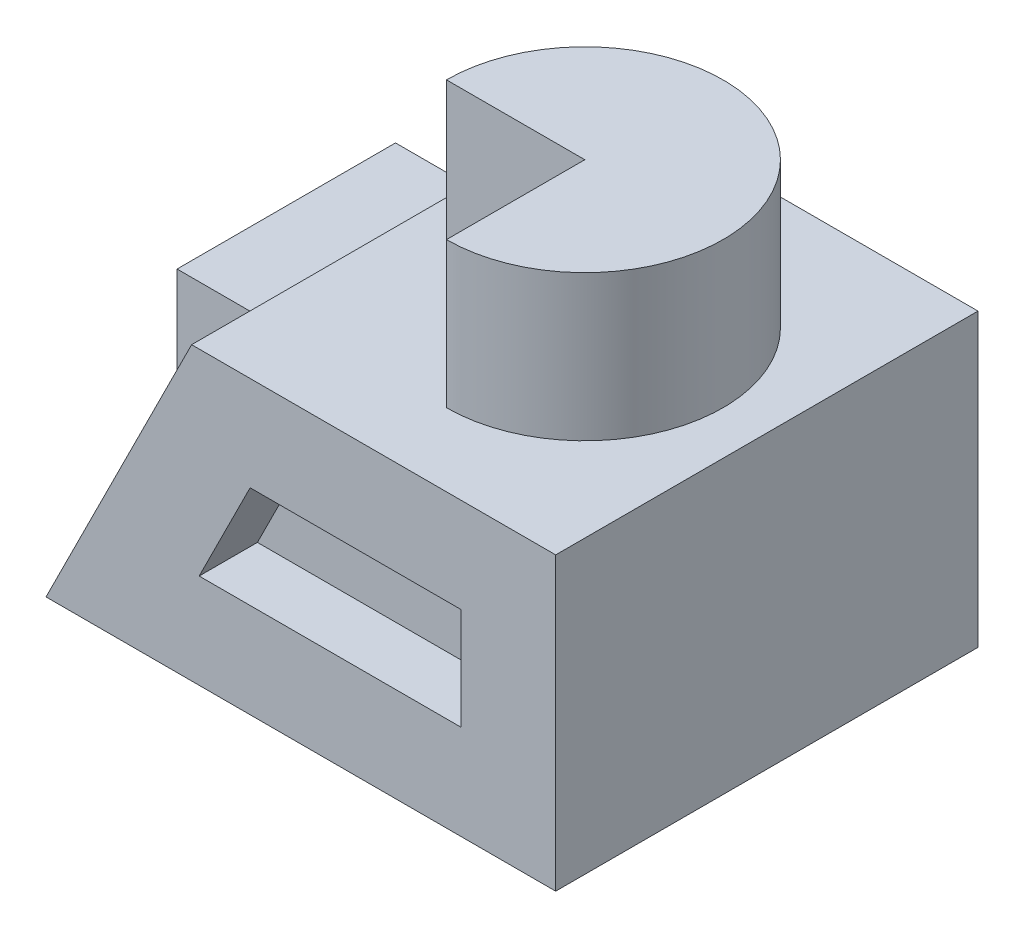
ISO-10303-21;
HEADER;
FILE_DESCRIPTION(('STEP AP214'),'2;1');
FILE_NAME('part.step','',(''),(''),'','','');
FILE_SCHEMA(('AUTOMOTIVE_DESIGN { 1 0 10303 214 1 1 1 1 }'));
ENDSEC;
DATA;
#1=APPLICATION_CONTEXT('core data for automotive mechanical design processes');
#2=APPLICATION_PROTOCOL_DEFINITION('international standard','automotive_design',2000,#1);
#3=PRODUCT_CONTEXT('',#1,'mechanical');
#4=PRODUCT('Part','Part','',(#3));
#5=PRODUCT_RELATED_PRODUCT_CATEGORY('part','',(#4));
#6=PRODUCT_DEFINITION_FORMATION('','',#4);
#7=PRODUCT_DEFINITION_CONTEXT('part definition',#1,'design');
#8=PRODUCT_DEFINITION('design','',#6,#7);
#9=PRODUCT_DEFINITION_SHAPE('','',#8);
#10=(LENGTH_UNIT() NAMED_UNIT(*) SI_UNIT(.MILLI.,.METRE.));
#11=(NAMED_UNIT(*) PLANE_ANGLE_UNIT() SI_UNIT($,.RADIAN.));
#12=(NAMED_UNIT(*) SI_UNIT($,.STERADIAN.) SOLID_ANGLE_UNIT());
#13=UNCERTAINTY_MEASURE_WITH_UNIT(LENGTH_MEASURE(1.E-05),#10,'distance_accuracy_value','');
#14=(GEOMETRIC_REPRESENTATION_CONTEXT(3) GLOBAL_UNCERTAINTY_ASSIGNED_CONTEXT((#13)) GLOBAL_UNIT_ASSIGNED_CONTEXT((#10,
#11,#12)) REPRESENTATION_CONTEXT('',''));
#15=CARTESIAN_POINT('',(0.,0.,0.));
#16=DIRECTION('',(0.,0.,1.));
#17=DIRECTION('',(1.,0.,0.));
#18=AXIS2_PLACEMENT_3D('',#15,#16,#17);
#19=CARTESIAN_POINT('',(0.,20.,58.));
#20=DIRECTION('',(0.,1.,0.));
#21=DIRECTION('',(0.,0.,1.));
#22=AXIS2_PLACEMENT_3D('',#19,#20,#21);
#23=PLANE('',#22);
#24=DIRECTION('',(1.,0.,0.));
#25=VECTOR('',#24,1.);
#26=CARTESIAN_POINT('',(0.,20.,0.));
#27=LINE('',#26,#25);
#28=CARTESIAN_POINT('',(-15.,20.,0.));
#29=VERTEX_POINT('',#28);
#30=CARTESIAN_POINT('',(35.,20.,0.));
#31=VERTEX_POINT('',#30);
#32=EDGE_CURVE('E238',#29,#31,#27,.T.);
#33=ORIENTED_EDGE('',*,*,#32,.F.);
#34=DIRECTION('',(0.,0.,-1.));
#35=VECTOR('',#34,1.);
#36=CARTESIAN_POINT('',(-15.,20.,58.));
#37=LINE('',#36,#35);
#38=CARTESIAN_POINT('',(-15.,20.,58.));
#39=VERTEX_POINT('',#38);
#40=EDGE_CURVE('E244',#39,#29,#37,.T.);
#41=ORIENTED_EDGE('',*,*,#40,.F.);
#42=DIRECTION('',(1.,0.,0.));
#43=VECTOR('',#42,1.);
#44=CARTESIAN_POINT('',(0.,20.,58.));
#45=LINE('',#44,#43);
#46=CARTESIAN_POINT('',(35.,20.,58.));
#47=VERTEX_POINT('',#46);
#48=EDGE_CURVE('E226',#39,#47,#45,.T.);
#49=ORIENTED_EDGE('',*,*,#48,.T.);
#50=DIRECTION('',(0.,0.,-1.));
#51=VECTOR('',#50,1.);
#52=CARTESIAN_POINT('',(35.,20.,58.));
#53=LINE('',#52,#51);
#54=EDGE_CURVE('E45',#47,#31,#53,.T.);
#55=ORIENTED_EDGE('',*,*,#54,.T.);
#56=EDGE_LOOP('',(#33,#41,#49,#55));
#57=FACE_BOUND('',#56,.T.);
#58=DIRECTION('',(1.,0.,0.));
#59=VECTOR('',#58,1.);
#60=CARTESIAN_POINT('',(0.,20.,29.));
#61=LINE('',#60,#59);
#62=CARTESIAN_POINT('',(-9.00000000000001,20.,29.));
#63=VERTEX_POINT('',#62);
#64=CARTESIAN_POINT('',(9.99999999999998,20.,29.));
#65=VERTEX_POINT('',#64);
#66=EDGE_CURVE('E209',#63,#65,#61,.T.);
#67=ORIENTED_EDGE('',*,*,#66,.F.);
#68=CARTESIAN_POINT('',(9.99999999999998,20.,29.));
#69=DIRECTION('',(0.,1.,0.));
#70=DIRECTION('',(0.,0.,1.));
#71=AXIS2_PLACEMENT_3D('',#68,#69,#70);
#72=CIRCLE('',#71,19.);
#73=CARTESIAN_POINT('',(9.99999999999998,20.,48.));
#74=VERTEX_POINT('',#73);
#75=EDGE_CURVE('E192',#74,#63,#72,.T.);
#76=ORIENTED_EDGE('',*,*,#75,.F.);
#77=DIRECTION('',(0.,0.,1.));
#78=VECTOR('',#77,1.);
#79=CARTESIAN_POINT('',(9.99999999999998,20.,0.));
#80=LINE('',#79,#78);
#81=EDGE_CURVE('E202',#65,#74,#80,.T.);
#82=ORIENTED_EDGE('',*,*,#81,.F.);
#83=EDGE_LOOP('',(#67,#76,#82));
#84=FACE_BOUND('',#83,.T.);
#85=ADVANCED_FACE('F37',(#57,#84),#23,.T.);
#86=CARTESIAN_POINT('',(0.,-20.,58.));
#87=DIRECTION('',(0.,1.,0.));
#88=DIRECTION('',(0.,0.,1.));
#89=AXIS2_PLACEMENT_3D('',#86,#87,#88);
#90=PLANE('',#89);
#91=DIRECTION('',(1.,0.,0.));
#92=VECTOR('',#91,1.);
#93=CARTESIAN_POINT('',(0.,-20.,0.));
#94=LINE('',#93,#92);
#95=CARTESIAN_POINT('',(-35.,-20.,0.));
#96=VERTEX_POINT('',#95);
#97=CARTESIAN_POINT('',(35.,-20.,0.));
#98=VERTEX_POINT('',#97);
#99=EDGE_CURVE('E219',#96,#98,#94,.T.);
#100=ORIENTED_EDGE('',*,*,#99,.T.);
#101=DIRECTION('',(0.,0.,-1.));
#102=VECTOR('',#101,1.);
#103=CARTESIAN_POINT('',(35.,-20.,58.));
#104=LINE('',#103,#102);
#105=CARTESIAN_POINT('',(35.,-20.,58.));
#106=VERTEX_POINT('',#105);
#107=EDGE_CURVE('E11',#106,#98,#104,.T.);
#108=ORIENTED_EDGE('',*,*,#107,.F.);
#109=DIRECTION('',(1.,0.,0.));
#110=VECTOR('',#109,1.);
#111=CARTESIAN_POINT('',(0.,-20.,58.));
#112=LINE('',#111,#110);
#113=CARTESIAN_POINT('',(-35.,-20.,58.));
#114=VERTEX_POINT('',#113);
#115=EDGE_CURVE('E220',#114,#106,#112,.T.);
#116=ORIENTED_EDGE('',*,*,#115,.F.);
#117=DIRECTION('',(0.,0.,-1.));
#118=VECTOR('',#117,1.);
#119=CARTESIAN_POINT('',(-35.,-20.,58.));
#120=LINE('',#119,#118);
#121=EDGE_CURVE('E232',#114,#96,#120,.T.);
#122=ORIENTED_EDGE('',*,*,#121,.T.);
#123=EDGE_LOOP('',(#100,#108,#116,#122));
#124=FACE_BOUND('',#123,.T.);
#125=ADVANCED_FACE('F39',(#124),#90,.F.);
#126=CARTESIAN_POINT('',(35.,0.,58.));
#127=DIRECTION('',(-1.,0.,0.));
#128=DIRECTION('',(0.,0.,1.));
#129=AXIS2_PLACEMENT_3D('',#126,#127,#128);
#130=PLANE('',#129);
#131=DIRECTION('',(0.,1.,0.));
#132=VECTOR('',#131,1.);
#133=CARTESIAN_POINT('',(35.,0.,0.));
#134=LINE('',#133,#132);
#135=EDGE_CURVE('E235',#98,#31,#134,.T.);
#136=ORIENTED_EDGE('',*,*,#135,.T.);
#137=ORIENTED_EDGE('',*,*,#54,.F.);
#138=DIRECTION('',(0.,1.,0.));
#139=VECTOR('',#138,1.);
#140=CARTESIAN_POINT('',(35.,0.,58.));
#141=LINE('',#140,#139);
#142=EDGE_CURVE('E223',#106,#47,#141,.T.);
#143=ORIENTED_EDGE('',*,*,#142,.F.);
#144=ORIENTED_EDGE('',*,*,#107,.T.);
#145=EDGE_LOOP('',(#136,#137,#143,#144));
#146=FACE_BOUND('',#145,.T.);
#147=ADVANCED_FACE('F251',(#146),#130,.F.);
#148=CARTESIAN_POINT('',(-20.,10.,58.));
#149=DIRECTION('',(-0.894427190999916,0.447213595499958,0.));
#150=DIRECTION('',(-0.447213595499958,-0.894427190999916,0.));
#151=AXIS2_PLACEMENT_3D('',#148,#149,#150);
#152=PLANE('',#151);
#153=DIRECTION('',(0.447213595499958,0.894427190999916,0.));
#154=VECTOR('',#153,1.);
#155=CARTESIAN_POINT('',(-18.,14.,44.));
#156=LINE('',#155,#154);
#157=CARTESIAN_POINT('',(-31.,-12.,44.));
#158=VERTEX_POINT('',#157);
#159=CARTESIAN_POINT('',(-18.,14.,44.));
#160=VERTEX_POINT('',#159);
#161=EDGE_CURVE('E156',#158,#160,#156,.T.);
#162=ORIENTED_EDGE('',*,*,#161,.F.);
#163=DIRECTION('',(0.,0.,-1.));
#164=VECTOR('',#163,1.);
#165=CARTESIAN_POINT('',(-31.,-12.,44.));
#166=LINE('',#165,#164);
#167=CARTESIAN_POINT('',(-31.,-12.,14.));
#168=VERTEX_POINT('',#167);
#169=EDGE_CURVE('E148',#158,#168,#166,.T.);
#170=ORIENTED_EDGE('',*,*,#169,.T.);
#171=DIRECTION('',(0.447213595499958,0.894427190999916,0.));
#172=VECTOR('',#171,1.);
#173=CARTESIAN_POINT('',(-18.,14.,14.));
#174=LINE('',#173,#172);
#175=CARTESIAN_POINT('',(-18.,14.,14.));
#176=VERTEX_POINT('',#175);
#177=EDGE_CURVE('E153',#168,#176,#174,.T.);
#178=ORIENTED_EDGE('',*,*,#177,.T.);
#179=DIRECTION('',(0.,0.,-1.));
#180=VECTOR('',#179,1.);
#181=CARTESIAN_POINT('',(-18.,14.,44.));
#182=LINE('',#181,#180);
#183=EDGE_CURVE('E147',#160,#176,#182,.T.);
#184=ORIENTED_EDGE('',*,*,#183,.F.);
#185=EDGE_LOOP('',(#162,#170,#178,#184));
#186=FACE_BOUND('',#185,.T.);
#187=DIRECTION('',(0.447213595499958,0.894427190999916,0.));
#188=VECTOR('',#187,1.);
#189=CARTESIAN_POINT('',(-20.,10.,0.));
#190=LINE('',#189,#188);
#191=EDGE_CURVE('E224',#96,#29,#190,.T.);
#192=ORIENTED_EDGE('',*,*,#191,.F.);
#193=ORIENTED_EDGE('',*,*,#121,.F.);
#194=DIRECTION('',(0.447213595499958,0.894427190999916,0.));
#195=VECTOR('',#194,1.);
#196=CARTESIAN_POINT('',(-20.,10.,58.));
#197=LINE('',#196,#195);
#198=EDGE_CURVE('E229',#114,#39,#197,.T.);
#199=ORIENTED_EDGE('',*,*,#198,.T.);
#200=ORIENTED_EDGE('',*,*,#40,.T.);
#201=EDGE_LOOP('',(#192,#193,#199,#200));
#202=FACE_BOUND('',#201,.T.);
#203=ADVANCED_FACE('F258',(#186,#202),#152,.T.);
#204=CARTESIAN_POINT('',(0.,0.,58.));
#205=DIRECTION('',(0.,0.,1.));
#206=DIRECTION('',(1.,0.,0.));
#207=AXIS2_PLACEMENT_3D('',#204,#205,#206);
#208=PLANE('',#207);
#209=DIRECTION('',(1.,0.,0.));
#210=VECTOR('',#209,1.);
#211=CARTESIAN_POINT('',(-13.9655581462514,-7.00000000000001,58.));
#212=LINE('',#211,#210);
#213=CARTESIAN_POINT('',(-13.9655581462514,-7.00000000000001,58.));
#214=VERTEX_POINT('',#213);
#215=CARTESIAN_POINT('',(22.,-7.00000000000001,58.));
#216=VERTEX_POINT('',#215);
#217=EDGE_CURVE('E60',#214,#216,#212,.T.);
#218=ORIENTED_EDGE('',*,*,#217,.F.);
#219=DIRECTION('',(-0.447213595499958,-0.894427190999916,0.));
#220=VECTOR('',#219,1.);
#221=CARTESIAN_POINT('',(-6.96555814625139,7.,58.));
#222=LINE('',#221,#220);
#223=CARTESIAN_POINT('',(-6.96555814625139,7.,58.));
#224=VERTEX_POINT('',#223);
#225=EDGE_CURVE('E171',#224,#214,#222,.T.);
#226=ORIENTED_EDGE('',*,*,#225,.F.);
#227=DIRECTION('',(-1.,0.,0.));
#228=VECTOR('',#227,1.);
#229=CARTESIAN_POINT('',(22.,7.,58.));
#230=LINE('',#229,#228);
#231=CARTESIAN_POINT('',(22.,7.,58.));
#232=VERTEX_POINT('',#231);
#233=EDGE_CURVE('E185',#232,#224,#230,.T.);
#234=ORIENTED_EDGE('',*,*,#233,.F.);
#235=DIRECTION('',(0.,1.,0.));
#236=VECTOR('',#235,1.);
#237=CARTESIAN_POINT('',(22.,-7.00000000000001,58.));
#238=LINE('',#237,#236);
#239=EDGE_CURVE('E182',#216,#232,#238,.T.);
#240=ORIENTED_EDGE('',*,*,#239,.F.);
#241=EDGE_LOOP('',(#218,#226,#234,#240));
#242=FACE_BOUND('',#241,.T.);
#243=ORIENTED_EDGE('',*,*,#115,.T.);
#244=ORIENTED_EDGE('',*,*,#142,.T.);
#245=ORIENTED_EDGE('',*,*,#48,.F.);
#246=ORIENTED_EDGE('',*,*,#198,.F.);
#247=EDGE_LOOP('',(#243,#244,#245,#246));
#248=FACE_BOUND('',#247,.T.);
#249=ADVANCED_FACE('F262',(#242,#248),#208,.T.);
#250=CARTESIAN_POINT('',(0.,0.,0.));
#251=DIRECTION('',(0.,0.,1.));
#252=DIRECTION('',(1.,0.,0.));
#253=AXIS2_PLACEMENT_3D('',#250,#251,#252);
#254=PLANE('',#253);
#255=ORIENTED_EDGE('',*,*,#99,.F.);
#256=ORIENTED_EDGE('',*,*,#191,.T.);
#257=ORIENTED_EDGE('',*,*,#32,.T.);
#258=ORIENTED_EDGE('',*,*,#135,.F.);
#259=EDGE_LOOP('',(#255,#256,#257,#258));
#260=FACE_BOUND('',#259,.T.);
#261=ADVANCED_FACE('F255',(#260),#254,.F.);
#262=CARTESIAN_POINT('',(9.99999999999998,40.,29.));
#263=DIRECTION('',(0.,-1.,0.));
#264=DIRECTION('',(0.,0.,-1.));
#265=AXIS2_PLACEMENT_3D('',#262,#263,#264);
#266=CYLINDRICAL_SURFACE('',#265,19.);
#267=ORIENTED_EDGE('',*,*,#75,.T.);
#268=DIRECTION('',(0.,-1.,0.));
#269=VECTOR('',#268,1.);
#270=CARTESIAN_POINT('',(-9.00000000000001,40.,29.));
#271=LINE('',#270,#269);
#272=CARTESIAN_POINT('',(-9.00000000000001,40.,29.));
#273=VERTEX_POINT('',#272);
#274=EDGE_CURVE('E217',#273,#63,#271,.T.);
#275=ORIENTED_EDGE('',*,*,#274,.F.);
#276=CARTESIAN_POINT('',(9.99999999999998,40.,29.));
#277=DIRECTION('',(0.,1.,0.));
#278=DIRECTION('',(0.,0.,1.));
#279=AXIS2_PLACEMENT_3D('',#276,#277,#278);
#280=CIRCLE('',#279,19.);
#281=CARTESIAN_POINT('',(9.99999999999998,40.,48.));
#282=VERTEX_POINT('',#281);
#283=EDGE_CURVE('E198',#282,#273,#280,.T.);
#284=ORIENTED_EDGE('',*,*,#283,.F.);
#285=DIRECTION('',(0.,-1.,0.));
#286=VECTOR('',#285,1.);
#287=CARTESIAN_POINT('',(9.99999999999998,40.,48.));
#288=LINE('',#287,#286);
#289=EDGE_CURVE('E206',#282,#74,#288,.T.);
#290=ORIENTED_EDGE('',*,*,#289,.T.);
#291=EDGE_LOOP('',(#267,#275,#284,#290));
#292=FACE_BOUND('',#291,.T.);
#293=ADVANCED_FACE('F278',(#292),#266,.T.);
#294=CARTESIAN_POINT('',(0.,40.,29.));
#295=DIRECTION('',(0.,0.,-1.));
#296=DIRECTION('',(-1.,0.,0.));
#297=AXIS2_PLACEMENT_3D('',#294,#295,#296);
#298=PLANE('',#297);
#299=ORIENTED_EDGE('',*,*,#66,.T.);
#300=DIRECTION('',(0.,-1.,0.));
#301=VECTOR('',#300,1.);
#302=CARTESIAN_POINT('',(9.99999999999998,40.,29.));
#303=LINE('',#302,#301);
#304=CARTESIAN_POINT('',(9.99999999999998,40.,29.));
#305=VERTEX_POINT('',#304);
#306=EDGE_CURVE('E215',#305,#65,#303,.T.);
#307=ORIENTED_EDGE('',*,*,#306,.F.);
#308=DIRECTION('',(1.,0.,0.));
#309=VECTOR('',#308,1.);
#310=CARTESIAN_POINT('',(0.,40.,29.));
#311=LINE('',#310,#309);
#312=EDGE_CURVE('E201',#273,#305,#311,.T.);
#313=ORIENTED_EDGE('',*,*,#312,.F.);
#314=ORIENTED_EDGE('',*,*,#274,.T.);
#315=EDGE_LOOP('',(#299,#307,#313,#314));
#316=FACE_BOUND('',#315,.T.);
#317=ADVANCED_FACE('F284',(#316),#298,.F.);
#318=CARTESIAN_POINT('',(9.99999999999998,40.,0.));
#319=DIRECTION('',(1.,0.,0.));
#320=DIRECTION('',(0.,0.,-1.));
#321=AXIS2_PLACEMENT_3D('',#318,#319,#320);
#322=PLANE('',#321);
#323=ORIENTED_EDGE('',*,*,#81,.T.);
#324=ORIENTED_EDGE('',*,*,#289,.F.);
#325=DIRECTION('',(0.,0.,1.));
#326=VECTOR('',#325,1.);
#327=CARTESIAN_POINT('',(9.99999999999998,40.,0.));
#328=LINE('',#327,#326);
#329=EDGE_CURVE('E204',#305,#282,#328,.T.);
#330=ORIENTED_EDGE('',*,*,#329,.F.);
#331=ORIENTED_EDGE('',*,*,#306,.T.);
#332=EDGE_LOOP('',(#323,#324,#330,#331));
#333=FACE_BOUND('',#332,.T.);
#334=ADVANCED_FACE('F288',(#333),#322,.F.);
#335=CARTESIAN_POINT('',(0.,40.,0.));
#336=DIRECTION('',(0.,1.,0.));
#337=DIRECTION('',(0.,0.,1.));
#338=AXIS2_PLACEMENT_3D('',#335,#336,#337);
#339=PLANE('',#338);
#340=ORIENTED_EDGE('',*,*,#283,.T.);
#341=ORIENTED_EDGE('',*,*,#312,.T.);
#342=ORIENTED_EDGE('',*,*,#329,.T.);
#343=EDGE_LOOP('',(#340,#341,#342));
#344=FACE_BOUND('',#343,.T.);
#345=ADVANCED_FACE('F292',(#344),#339,.T.);
#346=CARTESIAN_POINT('',(-13.9655581462514,-7.00000000000001,50.));
#347=DIRECTION('',(0.,-1.,0.));
#348=DIRECTION('',(1.,0.,0.));
#349=AXIS2_PLACEMENT_3D('',#346,#347,#348);
#350=PLANE('',#349);
#351=ORIENTED_EDGE('',*,*,#217,.T.);
#352=DIRECTION('',(0.,0.,1.));
#353=VECTOR('',#352,1.);
#354=CARTESIAN_POINT('',(22.,-7.00000000000001,50.));
#355=LINE('',#354,#353);
#356=CARTESIAN_POINT('',(22.,-7.00000000000001,50.));
#357=VERTEX_POINT('',#356);
#358=EDGE_CURVE('E180',#357,#216,#355,.T.);
#359=ORIENTED_EDGE('',*,*,#358,.F.);
#360=DIRECTION('',(1.,0.,0.));
#361=VECTOR('',#360,1.);
#362=CARTESIAN_POINT('',(-13.9655581462514,-7.00000000000001,50.));
#363=LINE('',#362,#361);
#364=CARTESIAN_POINT('',(-13.9655581462514,-7.00000000000001,50.));
#365=VERTEX_POINT('',#364);
#366=EDGE_CURVE('E167',#365,#357,#363,.T.);
#367=ORIENTED_EDGE('',*,*,#366,.F.);
#368=DIRECTION('',(0.,0.,1.));
#369=VECTOR('',#368,1.);
#370=CARTESIAN_POINT('',(-13.9655581462514,-7.00000000000001,50.));
#371=LINE('',#370,#369);
#372=EDGE_CURVE('E190',#365,#214,#371,.T.);
#373=ORIENTED_EDGE('',*,*,#372,.T.);
#374=EDGE_LOOP('',(#351,#359,#367,#373));
#375=FACE_BOUND('',#374,.T.);
#376=ADVANCED_FACE('F296',(#375),#350,.F.);
#377=CARTESIAN_POINT('',(-6.96555814625139,7.,50.));
#378=DIRECTION('',(-0.894427190999916,0.447213595499958,0.));
#379=DIRECTION('',(-0.447213595499958,-0.894427190999916,0.));
#380=AXIS2_PLACEMENT_3D('',#377,#378,#379);
#381=PLANE('',#380);
#382=ORIENTED_EDGE('',*,*,#225,.T.);
#383=ORIENTED_EDGE('',*,*,#372,.F.);
#384=DIRECTION('',(-0.447213595499958,-0.894427190999916,0.));
#385=VECTOR('',#384,1.);
#386=CARTESIAN_POINT('',(-6.96555814625139,7.,50.));
#387=LINE('',#386,#385);
#388=CARTESIAN_POINT('',(-6.96555814625139,7.,50.));
#389=VERTEX_POINT('',#388);
#390=EDGE_CURVE('E177',#389,#365,#387,.T.);
#391=ORIENTED_EDGE('',*,*,#390,.F.);
#392=DIRECTION('',(0.,0.,1.));
#393=VECTOR('',#392,1.);
#394=CARTESIAN_POINT('',(-6.96555814625139,7.,50.));
#395=LINE('',#394,#393);
#396=EDGE_CURVE('E193',#389,#224,#395,.T.);
#397=ORIENTED_EDGE('',*,*,#396,.T.);
#398=EDGE_LOOP('',(#382,#383,#391,#397));
#399=FACE_BOUND('',#398,.T.);
#400=ADVANCED_FACE('F300',(#399),#381,.F.);
#401=CARTESIAN_POINT('',(22.,7.,50.));
#402=DIRECTION('',(0.,1.,0.));
#403=DIRECTION('',(0.,0.,1.));
#404=AXIS2_PLACEMENT_3D('',#401,#402,#403);
#405=PLANE('',#404);
#406=ORIENTED_EDGE('',*,*,#233,.T.);
#407=ORIENTED_EDGE('',*,*,#396,.F.);
#408=DIRECTION('',(-1.,0.,0.));
#409=VECTOR('',#408,1.);
#410=CARTESIAN_POINT('',(22.,7.,50.));
#411=LINE('',#410,#409);
#412=CARTESIAN_POINT('',(22.,7.,50.));
#413=VERTEX_POINT('',#412);
#414=EDGE_CURVE('E174',#413,#389,#411,.T.);
#415=ORIENTED_EDGE('',*,*,#414,.F.);
#416=DIRECTION('',(0.,0.,1.));
#417=VECTOR('',#416,1.);
#418=CARTESIAN_POINT('',(22.,7.,50.));
#419=LINE('',#418,#417);
#420=EDGE_CURVE('E195',#413,#232,#419,.T.);
#421=ORIENTED_EDGE('',*,*,#420,.T.);
#422=EDGE_LOOP('',(#406,#407,#415,#421));
#423=FACE_BOUND('',#422,.T.);
#424=ADVANCED_FACE('F305',(#423),#405,.F.);
#425=CARTESIAN_POINT('',(22.,-7.00000000000001,50.));
#426=DIRECTION('',(1.,0.,0.));
#427=DIRECTION('',(0.,0.,-1.));
#428=AXIS2_PLACEMENT_3D('',#425,#426,#427);
#429=PLANE('',#428);
#430=ORIENTED_EDGE('',*,*,#239,.T.);
#431=ORIENTED_EDGE('',*,*,#420,.F.);
#432=DIRECTION('',(0.,1.,0.));
#433=VECTOR('',#432,1.);
#434=CARTESIAN_POINT('',(22.,-7.00000000000001,50.));
#435=LINE('',#434,#433);
#436=EDGE_CURVE('E170',#357,#413,#435,.T.);
#437=ORIENTED_EDGE('',*,*,#436,.F.);
#438=ORIENTED_EDGE('',*,*,#358,.T.);
#439=EDGE_LOOP('',(#430,#431,#437,#438));
#440=FACE_BOUND('',#439,.T.);
#441=ADVANCED_FACE('F301',(#440),#429,.F.);
#442=CARTESIAN_POINT('',(0.,0.,50.));
#443=DIRECTION('',(0.,0.,1.));
#444=DIRECTION('',(1.,0.,0.));
#445=AXIS2_PLACEMENT_3D('',#442,#443,#444);
#446=PLANE('',#445);
#447=ORIENTED_EDGE('',*,*,#366,.T.);
#448=ORIENTED_EDGE('',*,*,#436,.T.);
#449=ORIENTED_EDGE('',*,*,#414,.T.);
#450=ORIENTED_EDGE('',*,*,#390,.T.);
#451=EDGE_LOOP('',(#447,#448,#449,#450));
#452=FACE_BOUND('',#451,.T.);
#453=ADVANCED_FACE('F304',(#452),#446,.T.);
#454=CARTESIAN_POINT('',(-31.,14.,44.));
#455=DIRECTION('',(0.,-1.,0.));
#456=DIRECTION('',(1.,0.,0.));
#457=AXIS2_PLACEMENT_3D('',#454,#455,#456);
#458=PLANE('',#457);
#459=ORIENTED_EDGE('',*,*,#183,.T.);
#460=DIRECTION('',(-1.,0.,0.));
#461=VECTOR('',#460,1.);
#462=CARTESIAN_POINT('',(-31.,14.,14.));
#463=LINE('',#462,#461);
#464=CARTESIAN_POINT('',(-31.,14.,14.));
#465=VERTEX_POINT('',#464);
#466=EDGE_CURVE('E52',#176,#465,#463,.T.);
#467=ORIENTED_EDGE('',*,*,#466,.T.);
#468=DIRECTION('',(0.,0.,-1.));
#469=VECTOR('',#468,1.);
#470=CARTESIAN_POINT('',(-31.,14.,44.));
#471=LINE('',#470,#469);
#472=CARTESIAN_POINT('',(-31.,14.,44.));
#473=VERTEX_POINT('',#472);
#474=EDGE_CURVE('E140',#473,#465,#471,.T.);
#475=ORIENTED_EDGE('',*,*,#474,.F.);
#476=DIRECTION('',(-1.,0.,0.));
#477=VECTOR('',#476,1.);
#478=CARTESIAN_POINT('',(-31.,14.,44.));
#479=LINE('',#478,#477);
#480=EDGE_CURVE('E159',#160,#473,#479,.T.);
#481=ORIENTED_EDGE('',*,*,#480,.F.);
#482=EDGE_LOOP('',(#459,#467,#475,#481));
#483=FACE_BOUND('',#482,.T.);
#484=ADVANCED_FACE('F150',(#483),#458,.F.);
#485=CARTESIAN_POINT('',(-31.,-12.,44.));
#486=DIRECTION('',(1.,0.,0.));
#487=DIRECTION('',(0.,0.,-1.));
#488=AXIS2_PLACEMENT_3D('',#485,#486,#487);
#489=PLANE('',#488);
#490=ORIENTED_EDGE('',*,*,#474,.T.);
#491=DIRECTION('',(0.,-1.,0.));
#492=VECTOR('',#491,1.);
#493=CARTESIAN_POINT('',(-31.,-12.,14.));
#494=LINE('',#493,#492);
#495=EDGE_CURVE('E143',#465,#168,#494,.T.);
#496=ORIENTED_EDGE('',*,*,#495,.T.);
#497=ORIENTED_EDGE('',*,*,#169,.F.);
#498=DIRECTION('',(0.,-1.,0.));
#499=VECTOR('',#498,1.);
#500=CARTESIAN_POINT('',(-31.,-12.,44.));
#501=LINE('',#500,#499);
#502=EDGE_CURVE('E145',#473,#158,#501,.T.);
#503=ORIENTED_EDGE('',*,*,#502,.F.);
#504=EDGE_LOOP('',(#490,#496,#497,#503));
#505=FACE_BOUND('',#504,.T.);
#506=ADVANCED_FACE('F141',(#505),#489,.F.);
#507=CARTESIAN_POINT('',(0.,0.,44.));
#508=DIRECTION('',(0.,0.,1.));
#509=DIRECTION('',(1.,0.,0.));
#510=AXIS2_PLACEMENT_3D('',#507,#508,#509);
#511=PLANE('',#510);
#512=ORIENTED_EDGE('',*,*,#161,.T.);
#513=ORIENTED_EDGE('',*,*,#480,.T.);
#514=ORIENTED_EDGE('',*,*,#502,.T.);
#515=EDGE_LOOP('',(#512,#513,#514));
#516=FACE_BOUND('',#515,.T.);
#517=ADVANCED_FACE('F320',(#516),#511,.T.);
#518=CARTESIAN_POINT('',(0.,0.,14.));
#519=DIRECTION('',(0.,0.,1.));
#520=DIRECTION('',(1.,0.,0.));
#521=AXIS2_PLACEMENT_3D('',#518,#519,#520);
#522=PLANE('',#521);
#523=ORIENTED_EDGE('',*,*,#177,.F.);
#524=ORIENTED_EDGE('',*,*,#495,.F.);
#525=ORIENTED_EDGE('',*,*,#466,.F.);
#526=EDGE_LOOP('',(#523,#524,#525));
#527=FACE_BOUND('',#526,.T.);
#528=ADVANCED_FACE('F155',(#527),#522,.F.);
#529=CLOSED_SHELL('',(#85,#125,#147,#203,#249,#261,#293,#317,#334,#345,#376,#400,#424,#441,#453,
#484,#506,#517,#528));
#530=MANIFOLD_SOLID_BREP('B2',#529);
#531=ADVANCED_BREP_SHAPE_REPRESENTATION('',(#18,#530),#14);
#532=SHAPE_DEFINITION_REPRESENTATION(#9,#531);
ENDSEC;
END-ISO-10303-21;
